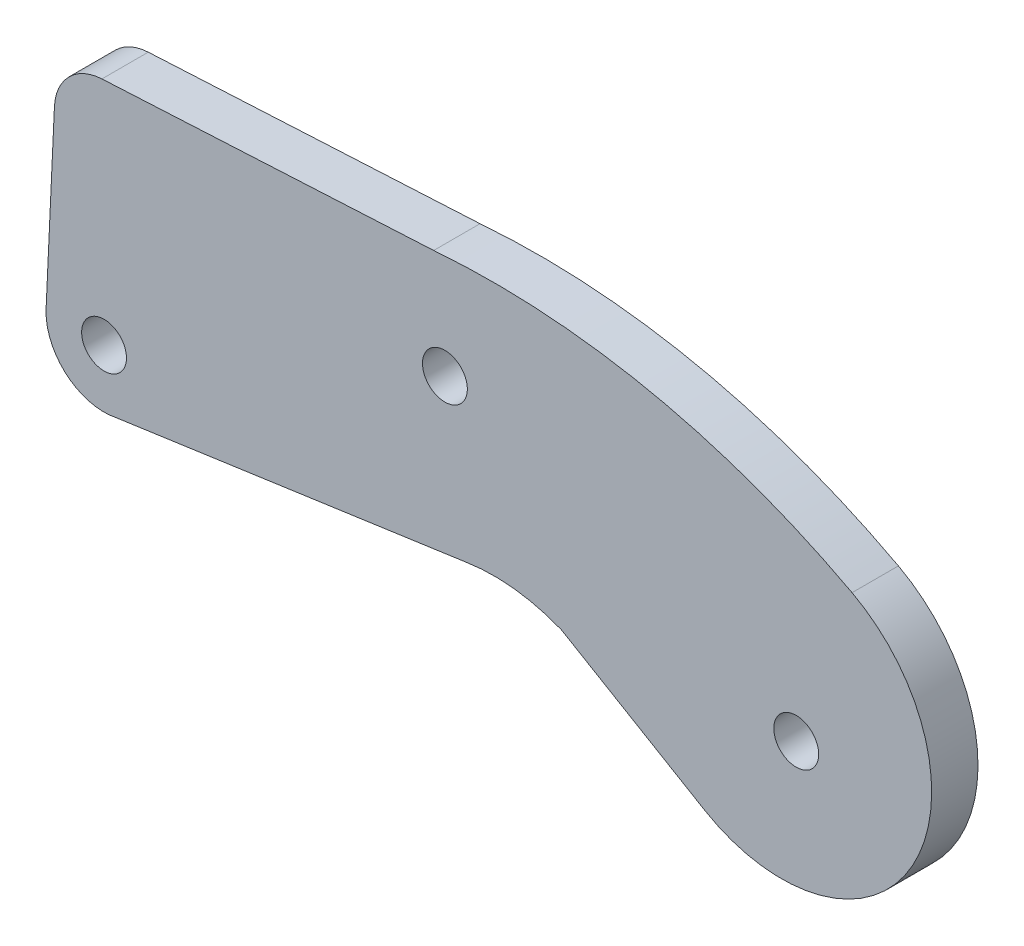
ISO-10303-21;
HEADER;
FILE_DESCRIPTION(('STEP AP214'),'2;1');
FILE_NAME('part.step','',(''),(''),'','','');
FILE_SCHEMA(('AUTOMOTIVE_DESIGN { 1 0 10303 214 1 1 1 1 }'));
ENDSEC;
DATA;
#1=APPLICATION_CONTEXT('core data for automotive mechanical design processes');
#2=APPLICATION_PROTOCOL_DEFINITION('international standard','automotive_design',2000,#1);
#3=PRODUCT_CONTEXT('',#1,'mechanical');
#4=PRODUCT('Part','Part','',(#3));
#5=PRODUCT_RELATED_PRODUCT_CATEGORY('part','',(#4));
#6=PRODUCT_DEFINITION_FORMATION('','',#4);
#7=PRODUCT_DEFINITION_CONTEXT('part definition',#1,'design');
#8=PRODUCT_DEFINITION('design','',#6,#7);
#9=PRODUCT_DEFINITION_SHAPE('','',#8);
#10=(LENGTH_UNIT() NAMED_UNIT(*) SI_UNIT(.MILLI.,.METRE.));
#11=(NAMED_UNIT(*) PLANE_ANGLE_UNIT() SI_UNIT($,.RADIAN.));
#12=(NAMED_UNIT(*) SI_UNIT($,.STERADIAN.) SOLID_ANGLE_UNIT());
#13=UNCERTAINTY_MEASURE_WITH_UNIT(LENGTH_MEASURE(1.E-05),#10,'distance_accuracy_value','');
#14=(GEOMETRIC_REPRESENTATION_CONTEXT(3) GLOBAL_UNCERTAINTY_ASSIGNED_CONTEXT((#13)) GLOBAL_UNIT_ASSIGNED_CONTEXT((#10,
#11,#12)) REPRESENTATION_CONTEXT('',''));
#15=CARTESIAN_POINT('',(0.,0.,0.));
#16=DIRECTION('',(0.,0.,1.));
#17=DIRECTION('',(1.,0.,0.));
#18=AXIS2_PLACEMENT_3D('',#15,#16,#17);
#19=CARTESIAN_POINT('',(-45.6,-19.1999999999999,6.2));
#20=DIRECTION('',(0.,0.,1.));
#21=DIRECTION('',(1.,0.,0.));
#22=AXIS2_PLACEMENT_3D('',#19,#20,#21);
#23=PLANE('',#22);
#24=CARTESIAN_POINT('',(-45.6,-19.1999999999999,6.2));
#25=DIRECTION('',(0.,0.,1.));
#26=DIRECTION('',(1.,0.,0.));
#27=AXIS2_PLACEMENT_3D('',#24,#25,#26);
#28=CIRCLE('',#27,3.);
#29=CARTESIAN_POINT('',(-48.6,-19.1999999999999,6.2));
#30=VERTEX_POINT('',#29);
#31=EDGE_CURVE('E197',#30,#30,#28,.T.);
#32=ORIENTED_EDGE('',*,*,#31,.F.);
#33=EDGE_LOOP('',(#32));
#34=FACE_BOUND('',#33,.T.);
#35=CARTESIAN_POINT('',(-45.6,-19.1999999999999,6.2));
#36=DIRECTION('',(0.,0.,1.));
#37=DIRECTION('',(1.,0.,0.));
#38=AXIS2_PLACEMENT_3D('',#35,#36,#37);
#39=CIRCLE('',#38,7.76659513557916);
#40=CARTESIAN_POINT('',(-53.3663500913287,-19.1383051143039,6.2));
#41=VERTEX_POINT('',#40);
#42=CARTESIAN_POINT('',(-44.,-26.8,6.2));
#43=VERTEX_POINT('',#42);
#44=EDGE_CURVE('E152',#41,#43,#39,.T.);
#45=ORIENTED_EDGE('',*,*,#44,.T.);
#46=DIRECTION('',(0.99001299182397,0.140976154082,0.));
#47=VECTOR('',#46,1.);
#48=CARTESIAN_POINT('',(-44.,-26.8,6.2));
#49=LINE('',#48,#47);
#50=CARTESIAN_POINT('',(2.7,-20.15,6.2));
#51=VERTEX_POINT('',#50);
#52=EDGE_CURVE('E95',#43,#51,#49,.T.);
#53=ORIENTED_EDGE('',*,*,#52,.T.);
#54=CARTESIAN_POINT('',(6.56962183960168,-43.8359879848504,6.2));
#55=DIRECTION('',(0.,0.,-1.));
#56=DIRECTION('',(1.,0.,0.));
#57=AXIS2_PLACEMENT_3D('',#54,#55,#56);
#58=CIRCLE('',#57,24.);
#59=CARTESIAN_POINT('',(15.6,-21.599705240646,6.2));
#60=VERTEX_POINT('',#59);
#61=EDGE_CURVE('E170',#51,#60,#58,.T.);
#62=ORIENTED_EDGE('',*,*,#61,.T.);
#63=DIRECTION('',(0.861052492589684,-0.508516081363305,0.));
#64=VECTOR('',#63,1.);
#65=CARTESIAN_POINT('',(15.6,-21.599705240646,6.2));
#66=LINE('',#65,#64);
#67=CARTESIAN_POINT('',(34.7684358994792,-32.9201043955809,6.2));
#68=VERTEX_POINT('',#67);
#69=EDGE_CURVE('E187',#60,#68,#66,.T.);
#70=ORIENTED_EDGE('',*,*,#69,.T.);
#71=CARTESIAN_POINT('',(45.,-15.5953548060977,6.2));
#72=DIRECTION('',(0.,0.,1.));
#73=DIRECTION('',(1.,0.,0.));
#74=AXIS2_PLACEMENT_3D('',#71,#72,#73);
#75=CIRCLE('',#74,20.1204337001309);
#76=CARTESIAN_POINT('',(54.4696096735487,2.15734484527917,6.2));
#77=VERTEX_POINT('',#76);
#78=EDGE_CURVE('E186',#68,#77,#75,.T.);
#79=ORIENTED_EDGE('',*,*,#78,.T.);
#80=CARTESIAN_POINT('',(6.55406866924001,-87.6700331995394,6.2));
#81=DIRECTION('',(0.,0.,1.));
#82=DIRECTION('',(1.,0.,0.));
#83=AXIS2_PLACEMENT_3D('',#80,#81,#82);
#84=CIRCLE('',#83,101.8079413216);
#85=CARTESIAN_POINT('',(-1.49999999999997,13.8188277360998,6.2));
#86=VERTEX_POINT('',#85);
#87=EDGE_CURVE('E117',#77,#86,#84,.T.);
#88=ORIENTED_EDGE('',*,*,#87,.T.);
#89=DIRECTION('',(-0.998638196370598,-0.0521704202559135,0.));
#90=VECTOR('',#89,1.);
#91=CARTESIAN_POINT('',(-45.8866454729241,11.5000000000001,6.2));
#92=LINE('',#91,#90);
#93=CARTESIAN_POINT('',(-45.8866454729241,11.5000000000001,6.2));
#94=VERTEX_POINT('',#93);
#95=EDGE_CURVE('E111',#86,#94,#92,.T.);
#96=ORIENTED_EDGE('',*,*,#95,.T.);
#97=CARTESIAN_POINT('',(-45.5366270007838,4.80000000000012,6.2));
#98=DIRECTION('',(0.,0.,1.));
#99=DIRECTION('',(1.,0.,0.));
#100=AXIS2_PLACEMENT_3D('',#97,#98,#99);
#101=CIRCLE('',#100,6.7091365264719);
#102=CARTESIAN_POINT('',(-52.238519213366,5.11169488569612,6.2));
#103=VERTEX_POINT('',#102);
#104=EDGE_CURVE('E115',#94,#103,#101,.T.);
#105=ORIENTED_EDGE('',*,*,#104,.T.);
#106=DIRECTION('',(-0.046458271413342,-0.998920231558699,0.));
#107=VECTOR('',#106,1.);
#108=CARTESIAN_POINT('',(-52.238519213366,5.11169488569612,6.2));
#109=LINE('',#108,#107);
#110=EDGE_CURVE('E49',#103,#41,#109,.T.);
#111=ORIENTED_EDGE('',*,*,#110,.T.);
#112=EDGE_LOOP('',(#45,#53,#62,#70,#79,#88,#96,#105,#111));
#113=FACE_BOUND('',#112,.T.);
#114=CARTESIAN_POINT('',(47.,-18.7999999999999,6.2));
#115=DIRECTION('',(0.,0.,1.));
#116=DIRECTION('',(1.,0.,0.));
#117=AXIS2_PLACEMENT_3D('',#114,#115,#116);
#118=CIRCLE('',#117,3.);
#119=CARTESIAN_POINT('',(44.,-18.7999999999999,6.2));
#120=VERTEX_POINT('',#119);
#121=EDGE_CURVE('E139',#120,#120,#118,.T.);
#122=ORIENTED_EDGE('',*,*,#121,.F.);
#123=EDGE_LOOP('',(#122));
#124=FACE_BOUND('',#123,.T.);
#125=CARTESIAN_POINT('',(0.,0.,6.2));
#126=DIRECTION('',(0.,0.,1.));
#127=DIRECTION('',(1.,0.,0.));
#128=AXIS2_PLACEMENT_3D('',#125,#126,#127);
#129=CIRCLE('',#128,3.);
#130=CARTESIAN_POINT('',(-3.,0.,6.2));
#131=VERTEX_POINT('',#130);
#132=EDGE_CURVE('E203',#131,#131,#129,.T.);
#133=ORIENTED_EDGE('',*,*,#132,.F.);
#134=EDGE_LOOP('',(#133));
#135=FACE_BOUND('',#134,.T.);
#136=ADVANCED_FACE('F32',(#34,#113,#124,#135),#23,.T.);
#137=CARTESIAN_POINT('',(-45.6,-19.1999999999999,0.));
#138=DIRECTION('',(0.,0.,1.));
#139=DIRECTION('',(1.,0.,0.));
#140=AXIS2_PLACEMENT_3D('',#137,#138,#139);
#141=PLANE('',#140);
#142=CARTESIAN_POINT('',(-45.6,-19.1999999999999,0.));
#143=DIRECTION('',(0.,0.,1.));
#144=DIRECTION('',(1.,0.,0.));
#145=AXIS2_PLACEMENT_3D('',#142,#143,#144);
#146=CIRCLE('',#145,7.76659513557916);
#147=CARTESIAN_POINT('',(-53.3663500913287,-19.1383051143039,0.));
#148=VERTEX_POINT('',#147);
#149=CARTESIAN_POINT('',(-44.,-26.8,0.));
#150=VERTEX_POINT('',#149);
#151=EDGE_CURVE('E135',#148,#150,#146,.T.);
#152=ORIENTED_EDGE('',*,*,#151,.F.);
#153=DIRECTION('',(-0.046458271413342,-0.998920231558699,0.));
#154=VECTOR('',#153,1.);
#155=CARTESIAN_POINT('',(-52.238519213366,5.11169488569612,0.));
#156=LINE('',#155,#154);
#157=CARTESIAN_POINT('',(-52.238519213366,5.11169488569612,0.));
#158=VERTEX_POINT('',#157);
#159=EDGE_CURVE('E87',#158,#148,#156,.T.);
#160=ORIENTED_EDGE('',*,*,#159,.F.);
#161=CARTESIAN_POINT('',(-45.5366270007838,4.80000000000012,0.));
#162=DIRECTION('',(0.,0.,1.));
#163=DIRECTION('',(1.,0.,0.));
#164=AXIS2_PLACEMENT_3D('',#161,#162,#163);
#165=CIRCLE('',#164,6.7091365264719);
#166=CARTESIAN_POINT('',(-45.8866454729241,11.5000000000001,0.));
#167=VERTEX_POINT('',#166);
#168=EDGE_CURVE('E81',#167,#158,#165,.T.);
#169=ORIENTED_EDGE('',*,*,#168,.F.);
#170=DIRECTION('',(-0.998638196370598,-0.0521704202559135,0.));
#171=VECTOR('',#170,1.);
#172=CARTESIAN_POINT('',(-45.8866454729241,11.5000000000001,0.));
#173=LINE('',#172,#171);
#174=CARTESIAN_POINT('',(-1.49999999999997,13.8188277360998,0.));
#175=VERTEX_POINT('',#174);
#176=EDGE_CURVE('E125',#175,#167,#173,.T.);
#177=ORIENTED_EDGE('',*,*,#176,.F.);
#178=CARTESIAN_POINT('',(6.55406866924001,-87.6700331995394,0.));
#179=DIRECTION('',(0.,0.,1.));
#180=DIRECTION('',(1.,0.,0.));
#181=AXIS2_PLACEMENT_3D('',#178,#179,#180);
#182=CIRCLE('',#181,101.8079413216);
#183=CARTESIAN_POINT('',(54.4696096735487,2.15734484527917,0.));
#184=VERTEX_POINT('',#183);
#185=EDGE_CURVE('E147',#184,#175,#182,.T.);
#186=ORIENTED_EDGE('',*,*,#185,.F.);
#187=CARTESIAN_POINT('',(45.,-15.5953548060977,0.));
#188=DIRECTION('',(0.,0.,1.));
#189=DIRECTION('',(1.,0.,0.));
#190=AXIS2_PLACEMENT_3D('',#187,#188,#189);
#191=CIRCLE('',#190,20.1204337001309);
#192=CARTESIAN_POINT('',(34.7684358994792,-32.9201043955809,0.));
#193=VERTEX_POINT('',#192);
#194=EDGE_CURVE('E145',#193,#184,#191,.T.);
#195=ORIENTED_EDGE('',*,*,#194,.F.);
#196=DIRECTION('',(0.861052492589684,-0.508516081363305,0.));
#197=VECTOR('',#196,1.);
#198=CARTESIAN_POINT('',(15.6,-21.599705240646,0.));
#199=LINE('',#198,#197);
#200=CARTESIAN_POINT('',(15.6,-21.599705240646,0.));
#201=VERTEX_POINT('',#200);
#202=EDGE_CURVE('E143',#201,#193,#199,.T.);
#203=ORIENTED_EDGE('',*,*,#202,.F.);
#204=CARTESIAN_POINT('',(6.56962183960168,-43.8359879848504,0.));
#205=DIRECTION('',(0.,0.,-1.));
#206=DIRECTION('',(1.,0.,0.));
#207=AXIS2_PLACEMENT_3D('',#204,#205,#206);
#208=CIRCLE('',#207,24.);
#209=CARTESIAN_POINT('',(2.7,-20.15,0.));
#210=VERTEX_POINT('',#209);
#211=EDGE_CURVE('E141',#210,#201,#208,.T.);
#212=ORIENTED_EDGE('',*,*,#211,.F.);
#213=DIRECTION('',(0.99001299182397,0.140976154082,0.));
#214=VECTOR('',#213,1.);
#215=CARTESIAN_POINT('',(-44.,-26.8,0.));
#216=LINE('',#215,#214);
#217=EDGE_CURVE('E138',#150,#210,#216,.T.);
#218=ORIENTED_EDGE('',*,*,#217,.F.);
#219=EDGE_LOOP('',(#152,#160,#169,#177,#186,#195,#203,#212,#218));
#220=FACE_BOUND('',#219,.T.);
#221=CARTESIAN_POINT('',(47.,-18.7999999999999,0.));
#222=DIRECTION('',(0.,0.,1.));
#223=DIRECTION('',(1.,0.,0.));
#224=AXIS2_PLACEMENT_3D('',#221,#222,#223);
#225=CIRCLE('',#224,3.);
#226=CARTESIAN_POINT('',(44.,-18.7999999999999,0.));
#227=VERTEX_POINT('',#226);
#228=EDGE_CURVE('E194',#227,#227,#225,.T.);
#229=ORIENTED_EDGE('',*,*,#228,.T.);
#230=EDGE_LOOP('',(#229));
#231=FACE_BOUND('',#230,.T.);
#232=CARTESIAN_POINT('',(-45.6,-19.1999999999999,0.));
#233=DIRECTION('',(0.,0.,1.));
#234=DIRECTION('',(1.,0.,0.));
#235=AXIS2_PLACEMENT_3D('',#232,#233,#234);
#236=CIRCLE('',#235,3.);
#237=CARTESIAN_POINT('',(-48.6,-19.1999999999999,0.));
#238=VERTEX_POINT('',#237);
#239=EDGE_CURVE('E200',#238,#238,#236,.T.);
#240=ORIENTED_EDGE('',*,*,#239,.T.);
#241=EDGE_LOOP('',(#240));
#242=FACE_BOUND('',#241,.T.);
#243=CARTESIAN_POINT('',(0.,0.,0.));
#244=DIRECTION('',(0.,0.,1.));
#245=DIRECTION('',(1.,0.,0.));
#246=AXIS2_PLACEMENT_3D('',#243,#244,#245);
#247=CIRCLE('',#246,3.);
#248=CARTESIAN_POINT('',(-3.,0.,0.));
#249=VERTEX_POINT('',#248);
#250=EDGE_CURVE('E206',#249,#249,#247,.T.);
#251=ORIENTED_EDGE('',*,*,#250,.T.);
#252=EDGE_LOOP('',(#251));
#253=FACE_BOUND('',#252,.T.);
#254=ADVANCED_FACE('F174',(#220,#231,#242,#253),#141,.F.);
#255=CARTESIAN_POINT('',(-45.6,-19.1999999999999,6.2));
#256=DIRECTION('',(0.,0.,-1.));
#257=DIRECTION('',(-1.,0.,0.));
#258=AXIS2_PLACEMENT_3D('',#255,#256,#257);
#259=CYLINDRICAL_SURFACE('',#258,7.76659513557916);
#260=ORIENTED_EDGE('',*,*,#151,.T.);
#261=DIRECTION('',(0.,0.,-1.));
#262=VECTOR('',#261,1.);
#263=CARTESIAN_POINT('',(-44.,-26.8,6.2));
#264=LINE('',#263,#262);
#265=EDGE_CURVE('E11',#43,#150,#264,.T.);
#266=ORIENTED_EDGE('',*,*,#265,.F.);
#267=ORIENTED_EDGE('',*,*,#44,.F.);
#268=DIRECTION('',(0.,0.,-1.));
#269=VECTOR('',#268,1.);
#270=CARTESIAN_POINT('',(-53.3663500913287,-19.1383051143039,6.2));
#271=LINE('',#270,#269);
#272=EDGE_CURVE('E131',#41,#148,#271,.T.);
#273=ORIENTED_EDGE('',*,*,#272,.T.);
#274=EDGE_LOOP('',(#260,#266,#267,#273));
#275=FACE_BOUND('',#274,.T.);
#276=ADVANCED_FACE('F34',(#275),#259,.T.);
#277=CARTESIAN_POINT('',(-44.,-26.8,6.2));
#278=DIRECTION('',(-0.140976154082,0.99001299182397,0.));
#279=DIRECTION('',(-0.99001299182397,-0.140976154082,0.));
#280=AXIS2_PLACEMENT_3D('',#277,#278,#279);
#281=PLANE('',#280);
#282=ORIENTED_EDGE('',*,*,#217,.T.);
#283=DIRECTION('',(0.,0.,-1.));
#284=VECTOR('',#283,1.);
#285=CARTESIAN_POINT('',(2.7,-20.15,6.2));
#286=LINE('',#285,#284);
#287=EDGE_CURVE('E41',#51,#210,#286,.T.);
#288=ORIENTED_EDGE('',*,*,#287,.F.);
#289=ORIENTED_EDGE('',*,*,#52,.F.);
#290=ORIENTED_EDGE('',*,*,#265,.T.);
#291=EDGE_LOOP('',(#282,#288,#289,#290));
#292=FACE_BOUND('',#291,.T.);
#293=ADVANCED_FACE('F243',(#292),#281,.F.);
#294=CARTESIAN_POINT('',(6.56962183960168,-43.8359879848504,6.2));
#295=DIRECTION('',(0.,0.,-1.));
#296=DIRECTION('',(-1.,0.,0.));
#297=AXIS2_PLACEMENT_3D('',#294,#295,#296);
#298=CYLINDRICAL_SURFACE('',#297,24.);
#299=ORIENTED_EDGE('',*,*,#211,.T.);
#300=DIRECTION('',(0.,0.,-1.));
#301=VECTOR('',#300,1.);
#302=CARTESIAN_POINT('',(15.6,-21.599705240646,6.2));
#303=LINE('',#302,#301);
#304=EDGE_CURVE('E162',#60,#201,#303,.T.);
#305=ORIENTED_EDGE('',*,*,#304,.F.);
#306=ORIENTED_EDGE('',*,*,#61,.F.);
#307=ORIENTED_EDGE('',*,*,#287,.T.);
#308=EDGE_LOOP('',(#299,#305,#306,#307));
#309=FACE_BOUND('',#308,.T.);
#310=ADVANCED_FACE('F168',(#309),#298,.F.);
#311=CARTESIAN_POINT('',(15.6,-21.599705240646,6.2));
#312=DIRECTION('',(0.508516081363305,0.861052492589684,0.));
#313=DIRECTION('',(-0.861052492589684,0.508516081363305,0.));
#314=AXIS2_PLACEMENT_3D('',#311,#312,#313);
#315=PLANE('',#314);
#316=ORIENTED_EDGE('',*,*,#202,.T.);
#317=DIRECTION('',(0.,0.,-1.));
#318=VECTOR('',#317,1.);
#319=CARTESIAN_POINT('',(34.7684358994792,-32.9201043955809,6.2));
#320=LINE('',#319,#318);
#321=EDGE_CURVE('E159',#68,#193,#320,.T.);
#322=ORIENTED_EDGE('',*,*,#321,.F.);
#323=ORIENTED_EDGE('',*,*,#69,.F.);
#324=ORIENTED_EDGE('',*,*,#304,.T.);
#325=EDGE_LOOP('',(#316,#322,#323,#324));
#326=FACE_BOUND('',#325,.T.);
#327=ADVANCED_FACE('F180',(#326),#315,.F.);
#328=CARTESIAN_POINT('',(45.,-15.5953548060977,6.2));
#329=DIRECTION('',(0.,0.,-1.));
#330=DIRECTION('',(-1.,0.,0.));
#331=AXIS2_PLACEMENT_3D('',#328,#329,#330);
#332=CYLINDRICAL_SURFACE('',#331,20.1204337001309);
#333=ORIENTED_EDGE('',*,*,#194,.T.);
#334=DIRECTION('',(0.,0.,-1.));
#335=VECTOR('',#334,1.);
#336=CARTESIAN_POINT('',(54.4696096735487,2.15734484527917,6.2));
#337=LINE('',#336,#335);
#338=EDGE_CURVE('E156',#77,#184,#337,.T.);
#339=ORIENTED_EDGE('',*,*,#338,.F.);
#340=ORIENTED_EDGE('',*,*,#78,.F.);
#341=ORIENTED_EDGE('',*,*,#321,.T.);
#342=EDGE_LOOP('',(#333,#339,#340,#341));
#343=FACE_BOUND('',#342,.T.);
#344=ADVANCED_FACE('F184',(#343),#332,.T.);
#345=CARTESIAN_POINT('',(6.55406866924001,-87.6700331995394,6.2));
#346=DIRECTION('',(0.,0.,-1.));
#347=DIRECTION('',(-1.,0.,0.));
#348=AXIS2_PLACEMENT_3D('',#345,#346,#347);
#349=CYLINDRICAL_SURFACE('',#348,101.8079413216);
#350=ORIENTED_EDGE('',*,*,#185,.T.);
#351=DIRECTION('',(0.,0.,-1.));
#352=VECTOR('',#351,1.);
#353=CARTESIAN_POINT('',(-1.49999999999997,13.8188277360998,6.2));
#354=LINE('',#353,#352);
#355=EDGE_CURVE('E126',#86,#175,#354,.T.);
#356=ORIENTED_EDGE('',*,*,#355,.F.);
#357=ORIENTED_EDGE('',*,*,#87,.F.);
#358=ORIENTED_EDGE('',*,*,#338,.T.);
#359=EDGE_LOOP('',(#350,#356,#357,#358));
#360=FACE_BOUND('',#359,.T.);
#361=ADVANCED_FACE('F234',(#360),#349,.T.);
#362=CARTESIAN_POINT('',(-45.8866454729241,11.5000000000001,6.2));
#363=DIRECTION('',(0.0521704202559135,-0.998638196370598,0.));
#364=DIRECTION('',(0.998638196370598,0.0521704202559135,0.));
#365=AXIS2_PLACEMENT_3D('',#362,#363,#364);
#366=PLANE('',#365);
#367=ORIENTED_EDGE('',*,*,#176,.T.);
#368=DIRECTION('',(0.,0.,-1.));
#369=VECTOR('',#368,1.);
#370=CARTESIAN_POINT('',(-45.8866454729241,11.5000000000001,6.2));
#371=LINE('',#370,#369);
#372=EDGE_CURVE('E122',#94,#167,#371,.T.);
#373=ORIENTED_EDGE('',*,*,#372,.F.);
#374=ORIENTED_EDGE('',*,*,#95,.F.);
#375=ORIENTED_EDGE('',*,*,#355,.T.);
#376=EDGE_LOOP('',(#367,#373,#374,#375));
#377=FACE_BOUND('',#376,.T.);
#378=ADVANCED_FACE('F123',(#377),#366,.F.);
#379=CARTESIAN_POINT('',(-45.5366270007838,4.80000000000012,6.2));
#380=DIRECTION('',(0.,0.,-1.));
#381=DIRECTION('',(-1.,0.,0.));
#382=AXIS2_PLACEMENT_3D('',#379,#380,#381);
#383=CYLINDRICAL_SURFACE('',#382,6.7091365264719);
#384=ORIENTED_EDGE('',*,*,#168,.T.);
#385=DIRECTION('',(0.,0.,-1.));
#386=VECTOR('',#385,1.);
#387=CARTESIAN_POINT('',(-52.238519213366,5.11169488569612,6.2));
#388=LINE('',#387,#386);
#389=EDGE_CURVE('E127',#103,#158,#388,.T.);
#390=ORIENTED_EDGE('',*,*,#389,.F.);
#391=ORIENTED_EDGE('',*,*,#104,.F.);
#392=ORIENTED_EDGE('',*,*,#372,.T.);
#393=EDGE_LOOP('',(#384,#390,#391,#392));
#394=FACE_BOUND('',#393,.T.);
#395=ADVANCED_FACE('F129',(#394),#383,.T.);
#396=CARTESIAN_POINT('',(-52.238519213366,5.11169488569612,6.2));
#397=DIRECTION('',(0.998920231558699,-0.046458271413342,0.));
#398=DIRECTION('',(0.046458271413342,0.998920231558699,0.));
#399=AXIS2_PLACEMENT_3D('',#396,#397,#398);
#400=PLANE('',#399);
#401=ORIENTED_EDGE('',*,*,#159,.T.);
#402=ORIENTED_EDGE('',*,*,#272,.F.);
#403=ORIENTED_EDGE('',*,*,#110,.F.);
#404=ORIENTED_EDGE('',*,*,#389,.T.);
#405=EDGE_LOOP('',(#401,#402,#403,#404));
#406=FACE_BOUND('',#405,.T.);
#407=ADVANCED_FACE('F227',(#406),#400,.F.);
#408=CARTESIAN_POINT('',(47.,-18.7999999999999,6.2));
#409=DIRECTION('',(0.,0.,-1.));
#410=DIRECTION('',(-1.,0.,0.));
#411=AXIS2_PLACEMENT_3D('',#408,#409,#410);
#412=CYLINDRICAL_SURFACE('',#411,3.);
#413=CARTESIAN_POINT('',(44.,-18.7999999999999,6.2));
#414=CARTESIAN_POINT('',(44.,-18.7999999999999,6.13541666666667));
#415=CARTESIAN_POINT('',(44.,-18.7999999999999,6.07083333333333));
#416=CARTESIAN_POINT('',(44.,-18.7999999999999,5.94166666666667));
#417=CARTESIAN_POINT('',(44.,-18.7999999999999,5.87708333333333));
#418=CARTESIAN_POINT('',(44.,-18.7999999999999,5.74791666666667));
#419=CARTESIAN_POINT('',(44.,-18.7999999999999,5.68333333333333));
#420=CARTESIAN_POINT('',(44.,-18.7999999999999,5.55416666666667));
#421=CARTESIAN_POINT('',(44.,-18.7999999999999,5.48958333333333));
#422=CARTESIAN_POINT('',(44.,-18.7999999999999,5.36041666666667));
#423=CARTESIAN_POINT('',(44.,-18.7999999999999,5.29583333333333));
#424=CARTESIAN_POINT('',(44.,-18.7999999999999,5.16666666666667));
#425=CARTESIAN_POINT('',(44.,-18.7999999999999,5.10208333333333));
#426=CARTESIAN_POINT('',(44.,-18.7999999999999,4.97291666666667));
#427=CARTESIAN_POINT('',(44.,-18.7999999999999,4.90833333333333));
#428=CARTESIAN_POINT('',(44.,-18.7999999999999,4.77916666666667));
#429=CARTESIAN_POINT('',(44.,-18.7999999999999,4.71458333333333));
#430=CARTESIAN_POINT('',(44.,-18.7999999999999,4.58541666666667));
#431=CARTESIAN_POINT('',(44.,-18.7999999999999,4.52083333333333));
#432=CARTESIAN_POINT('',(44.,-18.7999999999999,4.39166666666667));
#433=CARTESIAN_POINT('',(44.,-18.7999999999999,4.32708333333333));
#434=CARTESIAN_POINT('',(44.,-18.7999999999999,4.19791666666667));
#435=CARTESIAN_POINT('',(44.,-18.7999999999999,4.13333333333333));
#436=CARTESIAN_POINT('',(44.,-18.7999999999999,4.00416666666667));
#437=CARTESIAN_POINT('',(44.,-18.7999999999999,3.93958333333333));
#438=CARTESIAN_POINT('',(44.,-18.7999999999999,3.81041666666667));
#439=CARTESIAN_POINT('',(44.,-18.7999999999999,3.74583333333333));
#440=CARTESIAN_POINT('',(44.,-18.7999999999999,3.61666666666667));
#441=CARTESIAN_POINT('',(44.,-18.7999999999999,3.55208333333333));
#442=CARTESIAN_POINT('',(44.,-18.7999999999999,3.42291666666667));
#443=CARTESIAN_POINT('',(44.,-18.7999999999999,3.35833333333333));
#444=CARTESIAN_POINT('',(44.,-18.7999999999999,3.22916666666667));
#445=CARTESIAN_POINT('',(44.,-18.7999999999999,3.16458333333333));
#446=CARTESIAN_POINT('',(44.,-18.7999999999999,3.03541666666667));
#447=CARTESIAN_POINT('',(44.,-18.7999999999999,2.97083333333333));
#448=CARTESIAN_POINT('',(44.,-18.7999999999999,2.84166666666667));
#449=CARTESIAN_POINT('',(44.,-18.7999999999999,2.77708333333333));
#450=CARTESIAN_POINT('',(44.,-18.7999999999999,2.64791666666667));
#451=CARTESIAN_POINT('',(44.,-18.7999999999999,2.58333333333333));
#452=CARTESIAN_POINT('',(44.,-18.7999999999999,2.45416666666667));
#453=CARTESIAN_POINT('',(44.,-18.7999999999999,2.38958333333333));
#454=CARTESIAN_POINT('',(44.,-18.7999999999999,2.26041666666667));
#455=CARTESIAN_POINT('',(44.,-18.7999999999999,2.19583333333333));
#456=CARTESIAN_POINT('',(44.,-18.7999999999999,2.06666666666667));
#457=CARTESIAN_POINT('',(44.,-18.7999999999999,2.00208333333333));
#458=CARTESIAN_POINT('',(44.,-18.7999999999999,1.87291666666667));
#459=CARTESIAN_POINT('',(44.,-18.7999999999999,1.80833333333333));
#460=CARTESIAN_POINT('',(44.,-18.7999999999999,1.67916666666667));
#461=CARTESIAN_POINT('',(44.,-18.7999999999999,1.61458333333333));
#462=CARTESIAN_POINT('',(44.,-18.7999999999999,1.48541666666667));
#463=CARTESIAN_POINT('',(44.,-18.7999999999999,1.42083333333333));
#464=CARTESIAN_POINT('',(44.,-18.7999999999999,1.29166666666667));
#465=CARTESIAN_POINT('',(44.,-18.7999999999999,1.22708333333333));
#466=CARTESIAN_POINT('',(44.,-18.7999999999999,1.09791666666667));
#467=CARTESIAN_POINT('',(44.,-18.7999999999999,1.03333333333333));
#468=CARTESIAN_POINT('',(44.,-18.7999999999999,0.904166666666667));
#469=CARTESIAN_POINT('',(44.,-18.7999999999999,0.839583333333333));
#470=CARTESIAN_POINT('',(44.,-18.7999999999999,0.710416666666666));
#471=CARTESIAN_POINT('',(44.,-18.7999999999999,0.645833333333333));
#472=CARTESIAN_POINT('',(44.,-18.7999999999999,0.516666666666667));
#473=CARTESIAN_POINT('',(44.,-18.7999999999999,0.452083333333333));
#474=CARTESIAN_POINT('',(44.,-18.7999999999999,0.322916666666667));
#475=CARTESIAN_POINT('',(44.,-18.7999999999999,0.258333333333334));
#476=CARTESIAN_POINT('',(44.,-18.7999999999999,0.129166666666667));
#477=CARTESIAN_POINT('',(44.,-18.7999999999999,0.0645833333333335));
#478=CARTESIAN_POINT('',(44.,-18.7999999999999,0.));
#479=B_SPLINE_CURVE_WITH_KNOTS('',3,(#413,#414,#415,#416,#417,#418,#419,#420,#421,#422,#423,
#424,#425,#426,#427,#428,#429,#430,#431,#432,#433,#434,#435,#436,#437,#438,#439,#440,#441,#442,
#443,#444,#445,#446,#447,#448,#449,#450,#451,#452,#453,#454,#455,#456,#457,#458,#459,#460,#461,
#462,#463,#464,#465,#466,#467,#468,#469,#470,#471,#472,#473,#474,#475,#476,#477,#478),
.UNSPECIFIED.,.F.,.F.,(4,2,2,2,2,2,2,2,2,2,2,2,2,2,2,2,2,2,2,2,2,2,2,2,2,2,2,2,2,2,2,2,4),(0.,
0.193749999999999,0.3875,0.581249999999999,0.775,0.968749999999999,1.1625,1.35625,1.55,1.74375,
1.9375,2.13125,2.325,2.51875,2.7125,2.90625,3.1,3.29375,3.4875,3.68125,3.875,4.06875,4.2625,
4.45625,4.65,4.84375,5.0375,5.23125,5.425,5.61875,5.8125,6.00625,6.2),.UNSPECIFIED.);
#480=EDGE_CURVE('BSEAM224',#120,#227,#479,.T.);
#481=ORIENTED_EDGE('',*,*,#121,.T.);
#482=ORIENTED_EDGE('',*,*,#228,.F.);
#483=ORIENTED_EDGE('',*,*,#480,.T.);
#484=ORIENTED_EDGE('',*,*,#480,.F.);
#485=EDGE_LOOP('',(#481,#483,#482,#484));
#486=FACE_BOUND('',#485,.T.);
#487=ADVANCED_FACE('F224',(#486),#412,.F.);
#488=CARTESIAN_POINT('',(-45.6,-19.1999999999999,6.2));
#489=DIRECTION('',(0.,0.,-1.));
#490=DIRECTION('',(-1.,0.,0.));
#491=AXIS2_PLACEMENT_3D('',#488,#489,#490);
#492=CYLINDRICAL_SURFACE('',#491,3.);
#493=CARTESIAN_POINT('',(-48.6,-19.1999999999999,6.2));
#494=CARTESIAN_POINT('',(-48.6,-19.1999999999999,6.13541666666667));
#495=CARTESIAN_POINT('',(-48.6,-19.1999999999999,6.07083333333333));
#496=CARTESIAN_POINT('',(-48.6,-19.1999999999999,5.94166666666667));
#497=CARTESIAN_POINT('',(-48.6,-19.1999999999999,5.87708333333333));
#498=CARTESIAN_POINT('',(-48.6,-19.1999999999999,5.74791666666667));
#499=CARTESIAN_POINT('',(-48.6,-19.1999999999999,5.68333333333333));
#500=CARTESIAN_POINT('',(-48.6,-19.1999999999999,5.55416666666667));
#501=CARTESIAN_POINT('',(-48.6,-19.1999999999999,5.48958333333333));
#502=CARTESIAN_POINT('',(-48.6,-19.1999999999999,5.36041666666667));
#503=CARTESIAN_POINT('',(-48.6,-19.1999999999999,5.29583333333333));
#504=CARTESIAN_POINT('',(-48.6,-19.1999999999999,5.16666666666667));
#505=CARTESIAN_POINT('',(-48.6,-19.1999999999999,5.10208333333333));
#506=CARTESIAN_POINT('',(-48.6,-19.1999999999999,4.97291666666667));
#507=CARTESIAN_POINT('',(-48.6,-19.1999999999999,4.90833333333333));
#508=CARTESIAN_POINT('',(-48.6,-19.1999999999999,4.77916666666667));
#509=CARTESIAN_POINT('',(-48.6,-19.1999999999999,4.71458333333333));
#510=CARTESIAN_POINT('',(-48.6,-19.1999999999999,4.58541666666667));
#511=CARTESIAN_POINT('',(-48.6,-19.1999999999999,4.52083333333333));
#512=CARTESIAN_POINT('',(-48.6,-19.1999999999999,4.39166666666667));
#513=CARTESIAN_POINT('',(-48.6,-19.1999999999999,4.32708333333333));
#514=CARTESIAN_POINT('',(-48.6,-19.1999999999999,4.19791666666667));
#515=CARTESIAN_POINT('',(-48.6,-19.1999999999999,4.13333333333333));
#516=CARTESIAN_POINT('',(-48.6,-19.1999999999999,4.00416666666667));
#517=CARTESIAN_POINT('',(-48.6,-19.1999999999999,3.93958333333333));
#518=CARTESIAN_POINT('',(-48.6,-19.1999999999999,3.81041666666667));
#519=CARTESIAN_POINT('',(-48.6,-19.1999999999999,3.74583333333333));
#520=CARTESIAN_POINT('',(-48.6,-19.1999999999999,3.61666666666667));
#521=CARTESIAN_POINT('',(-48.6,-19.1999999999999,3.55208333333333));
#522=CARTESIAN_POINT('',(-48.6,-19.1999999999999,3.42291666666667));
#523=CARTESIAN_POINT('',(-48.6,-19.1999999999999,3.35833333333333));
#524=CARTESIAN_POINT('',(-48.6,-19.1999999999999,3.22916666666667));
#525=CARTESIAN_POINT('',(-48.6,-19.1999999999999,3.16458333333333));
#526=CARTESIAN_POINT('',(-48.6,-19.1999999999999,3.03541666666667));
#527=CARTESIAN_POINT('',(-48.6,-19.1999999999999,2.97083333333333));
#528=CARTESIAN_POINT('',(-48.6,-19.1999999999999,2.84166666666667));
#529=CARTESIAN_POINT('',(-48.6,-19.1999999999999,2.77708333333333));
#530=CARTESIAN_POINT('',(-48.6,-19.1999999999999,2.64791666666667));
#531=CARTESIAN_POINT('',(-48.6,-19.1999999999999,2.58333333333333));
#532=CARTESIAN_POINT('',(-48.6,-19.1999999999999,2.45416666666667));
#533=CARTESIAN_POINT('',(-48.6,-19.1999999999999,2.38958333333333));
#534=CARTESIAN_POINT('',(-48.6,-19.1999999999999,2.26041666666667));
#535=CARTESIAN_POINT('',(-48.6,-19.1999999999999,2.19583333333333));
#536=CARTESIAN_POINT('',(-48.6,-19.1999999999999,2.06666666666667));
#537=CARTESIAN_POINT('',(-48.6,-19.1999999999999,2.00208333333333));
#538=CARTESIAN_POINT('',(-48.6,-19.1999999999999,1.87291666666667));
#539=CARTESIAN_POINT('',(-48.6,-19.1999999999999,1.80833333333333));
#540=CARTESIAN_POINT('',(-48.6,-19.1999999999999,1.67916666666667));
#541=CARTESIAN_POINT('',(-48.6,-19.1999999999999,1.61458333333333));
#542=CARTESIAN_POINT('',(-48.6,-19.1999999999999,1.48541666666667));
#543=CARTESIAN_POINT('',(-48.6,-19.1999999999999,1.42083333333333));
#544=CARTESIAN_POINT('',(-48.6,-19.1999999999999,1.29166666666667));
#545=CARTESIAN_POINT('',(-48.6,-19.1999999999999,1.22708333333333));
#546=CARTESIAN_POINT('',(-48.6,-19.1999999999999,1.09791666666667));
#547=CARTESIAN_POINT('',(-48.6,-19.1999999999999,1.03333333333333));
#548=CARTESIAN_POINT('',(-48.6,-19.1999999999999,0.904166666666667));
#549=CARTESIAN_POINT('',(-48.6,-19.1999999999999,0.839583333333333));
#550=CARTESIAN_POINT('',(-48.6,-19.1999999999999,0.710416666666666));
#551=CARTESIAN_POINT('',(-48.6,-19.1999999999999,0.645833333333333));
#552=CARTESIAN_POINT('',(-48.6,-19.1999999999999,0.516666666666667));
#553=CARTESIAN_POINT('',(-48.6,-19.1999999999999,0.452083333333333));
#554=CARTESIAN_POINT('',(-48.6,-19.1999999999999,0.322916666666667));
#555=CARTESIAN_POINT('',(-48.6,-19.1999999999999,0.258333333333334));
#556=CARTESIAN_POINT('',(-48.6,-19.1999999999999,0.129166666666667));
#557=CARTESIAN_POINT('',(-48.6,-19.1999999999999,0.0645833333333335));
#558=CARTESIAN_POINT('',(-48.6,-19.1999999999999,0.));
#559=B_SPLINE_CURVE_WITH_KNOTS('',3,(#493,#494,#495,#496,#497,#498,#499,#500,#501,#502,#503,
#504,#505,#506,#507,#508,#509,#510,#511,#512,#513,#514,#515,#516,#517,#518,#519,#520,#521,#522,
#523,#524,#525,#526,#527,#528,#529,#530,#531,#532,#533,#534,#535,#536,#537,#538,#539,#540,#541,
#542,#543,#544,#545,#546,#547,#548,#549,#550,#551,#552,#553,#554,#555,#556,#557,#558),
.UNSPECIFIED.,.F.,.F.,(4,2,2,2,2,2,2,2,2,2,2,2,2,2,2,2,2,2,2,2,2,2,2,2,2,2,2,2,2,2,2,2,4),(0.,
0.193749999999999,0.3875,0.581249999999999,0.775,0.968749999999999,1.1625,1.35625,1.55,1.74375,
1.9375,2.13125,2.325,2.51875,2.7125,2.90625,3.1,3.29375,3.4875,3.68125,3.875,4.06875,4.2625,
4.45625,4.65,4.84375,5.0375,5.23125,5.425,5.61875,5.8125,6.00625,6.2),.UNSPECIFIED.);
#560=EDGE_CURVE('BSEAM312',#30,#238,#559,.T.);
#561=ORIENTED_EDGE('',*,*,#31,.T.);
#562=ORIENTED_EDGE('',*,*,#239,.F.);
#563=ORIENTED_EDGE('',*,*,#560,.T.);
#564=ORIENTED_EDGE('',*,*,#560,.F.);
#565=EDGE_LOOP('',(#561,#563,#562,#564));
#566=FACE_BOUND('',#565,.T.);
#567=ADVANCED_FACE('F312',(#566),#492,.F.);
#568=CARTESIAN_POINT('',(0.,0.,6.2));
#569=DIRECTION('',(0.,0.,-1.));
#570=DIRECTION('',(-1.,0.,0.));
#571=AXIS2_PLACEMENT_3D('',#568,#569,#570);
#572=CYLINDRICAL_SURFACE('',#571,3.);
#573=CARTESIAN_POINT('',(-3.,0.,6.2));
#574=CARTESIAN_POINT('',(-3.,0.,6.13541666666667));
#575=CARTESIAN_POINT('',(-3.,0.,6.07083333333333));
#576=CARTESIAN_POINT('',(-3.,0.,5.94166666666667));
#577=CARTESIAN_POINT('',(-3.,0.,5.87708333333333));
#578=CARTESIAN_POINT('',(-3.,0.,5.74791666666667));
#579=CARTESIAN_POINT('',(-3.,0.,5.68333333333333));
#580=CARTESIAN_POINT('',(-3.,0.,5.55416666666667));
#581=CARTESIAN_POINT('',(-3.,0.,5.48958333333333));
#582=CARTESIAN_POINT('',(-3.,0.,5.36041666666667));
#583=CARTESIAN_POINT('',(-3.,0.,5.29583333333333));
#584=CARTESIAN_POINT('',(-3.,0.,5.16666666666667));
#585=CARTESIAN_POINT('',(-3.,0.,5.10208333333333));
#586=CARTESIAN_POINT('',(-3.,0.,4.97291666666667));
#587=CARTESIAN_POINT('',(-3.,0.,4.90833333333333));
#588=CARTESIAN_POINT('',(-3.,0.,4.77916666666667));
#589=CARTESIAN_POINT('',(-3.,0.,4.71458333333333));
#590=CARTESIAN_POINT('',(-3.,0.,4.58541666666667));
#591=CARTESIAN_POINT('',(-3.,0.,4.52083333333333));
#592=CARTESIAN_POINT('',(-3.,0.,4.39166666666667));
#593=CARTESIAN_POINT('',(-3.,0.,4.32708333333333));
#594=CARTESIAN_POINT('',(-3.,0.,4.19791666666667));
#595=CARTESIAN_POINT('',(-3.,0.,4.13333333333333));
#596=CARTESIAN_POINT('',(-3.,0.,4.00416666666667));
#597=CARTESIAN_POINT('',(-3.,0.,3.93958333333333));
#598=CARTESIAN_POINT('',(-3.,0.,3.81041666666667));
#599=CARTESIAN_POINT('',(-3.,0.,3.74583333333333));
#600=CARTESIAN_POINT('',(-3.,0.,3.61666666666667));
#601=CARTESIAN_POINT('',(-3.,0.,3.55208333333333));
#602=CARTESIAN_POINT('',(-3.,0.,3.42291666666667));
#603=CARTESIAN_POINT('',(-3.,0.,3.35833333333333));
#604=CARTESIAN_POINT('',(-3.,0.,3.22916666666667));
#605=CARTESIAN_POINT('',(-3.,0.,3.16458333333333));
#606=CARTESIAN_POINT('',(-3.,0.,3.03541666666667));
#607=CARTESIAN_POINT('',(-3.,0.,2.97083333333333));
#608=CARTESIAN_POINT('',(-3.,0.,2.84166666666667));
#609=CARTESIAN_POINT('',(-3.,0.,2.77708333333333));
#610=CARTESIAN_POINT('',(-3.,0.,2.64791666666667));
#611=CARTESIAN_POINT('',(-3.,0.,2.58333333333333));
#612=CARTESIAN_POINT('',(-3.,0.,2.45416666666667));
#613=CARTESIAN_POINT('',(-3.,0.,2.38958333333333));
#614=CARTESIAN_POINT('',(-3.,0.,2.26041666666667));
#615=CARTESIAN_POINT('',(-3.,0.,2.19583333333333));
#616=CARTESIAN_POINT('',(-3.,0.,2.06666666666667));
#617=CARTESIAN_POINT('',(-3.,0.,2.00208333333333));
#618=CARTESIAN_POINT('',(-3.,0.,1.87291666666667));
#619=CARTESIAN_POINT('',(-3.,0.,1.80833333333333));
#620=CARTESIAN_POINT('',(-3.,0.,1.67916666666667));
#621=CARTESIAN_POINT('',(-3.,0.,1.61458333333333));
#622=CARTESIAN_POINT('',(-3.,0.,1.48541666666667));
#623=CARTESIAN_POINT('',(-3.,0.,1.42083333333333));
#624=CARTESIAN_POINT('',(-3.,0.,1.29166666666667));
#625=CARTESIAN_POINT('',(-3.,0.,1.22708333333333));
#626=CARTESIAN_POINT('',(-3.,0.,1.09791666666667));
#627=CARTESIAN_POINT('',(-3.,0.,1.03333333333333));
#628=CARTESIAN_POINT('',(-3.,0.,0.904166666666667));
#629=CARTESIAN_POINT('',(-3.,0.,0.839583333333333));
#630=CARTESIAN_POINT('',(-3.,0.,0.710416666666666));
#631=CARTESIAN_POINT('',(-3.,0.,0.645833333333333));
#632=CARTESIAN_POINT('',(-3.,0.,0.516666666666667));
#633=CARTESIAN_POINT('',(-3.,0.,0.452083333333333));
#634=CARTESIAN_POINT('',(-3.,0.,0.322916666666667));
#635=CARTESIAN_POINT('',(-3.,0.,0.258333333333334));
#636=CARTESIAN_POINT('',(-3.,0.,0.129166666666667));
#637=CARTESIAN_POINT('',(-3.,0.,0.0645833333333335));
#638=CARTESIAN_POINT('',(-3.,0.,0.));
#639=B_SPLINE_CURVE_WITH_KNOTS('',3,(#573,#574,#575,#576,#577,#578,#579,#580,#581,#582,#583,
#584,#585,#586,#587,#588,#589,#590,#591,#592,#593,#594,#595,#596,#597,#598,#599,#600,#601,#602,
#603,#604,#605,#606,#607,#608,#609,#610,#611,#612,#613,#614,#615,#616,#617,#618,#619,#620,#621,
#622,#623,#624,#625,#626,#627,#628,#629,#630,#631,#632,#633,#634,#635,#636,#637,#638),
.UNSPECIFIED.,.F.,.F.,(4,2,2,2,2,2,2,2,2,2,2,2,2,2,2,2,2,2,2,2,2,2,2,2,2,2,2,2,2,2,2,2,4),(0.,
0.193749999999999,0.3875,0.581249999999999,0.775,0.968749999999999,1.1625,1.35625,1.55,1.74375,
1.9375,2.13125,2.325,2.51875,2.7125,2.90625,3.1,3.29375,3.4875,3.68125,3.875,4.06875,4.2625,
4.45625,4.65,4.84375,5.0375,5.23125,5.425,5.61875,5.8125,6.00625,6.2),.UNSPECIFIED.);
#640=EDGE_CURVE('BSEAM212',#131,#249,#639,.T.);
#641=ORIENTED_EDGE('',*,*,#132,.T.);
#642=ORIENTED_EDGE('',*,*,#250,.F.);
#643=ORIENTED_EDGE('',*,*,#640,.T.);
#644=ORIENTED_EDGE('',*,*,#640,.F.);
#645=EDGE_LOOP('',(#641,#643,#642,#644));
#646=FACE_BOUND('',#645,.T.);
#647=ADVANCED_FACE('F212',(#646),#572,.F.);
#648=CLOSED_SHELL('',(#136,#254,#276,#293,#310,#327,#344,#361,#378,#395,#407,#487,#567,#647));
#649=MANIFOLD_SOLID_BREP('B2',#648);
#650=ADVANCED_BREP_SHAPE_REPRESENTATION('',(#18,#649),#14);
#651=SHAPE_DEFINITION_REPRESENTATION(#9,#650);
ENDSEC;
END-ISO-10303-21;
